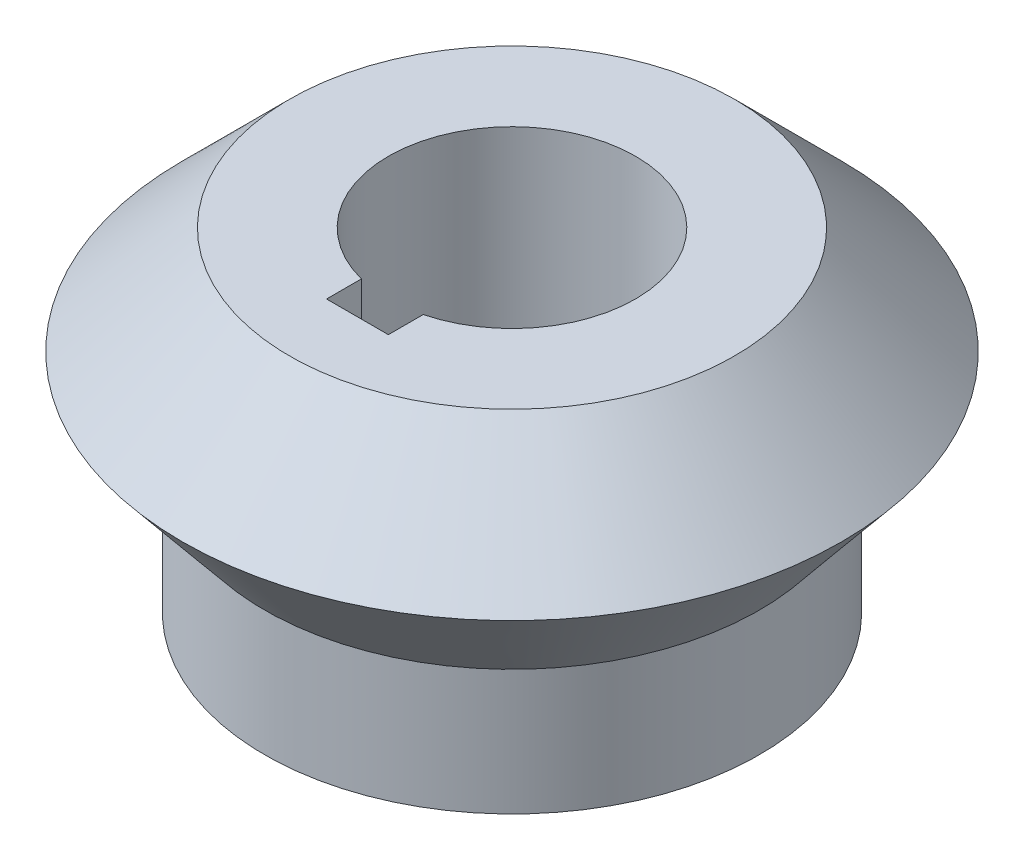
ISO-10303-21;
HEADER;
FILE_DESCRIPTION(('STEP AP214'),'2;1');
FILE_NAME('part.step','',(''),(''),'','','');
FILE_SCHEMA(('AUTOMOTIVE_DESIGN { 1 0 10303 214 1 1 1 1 }'));
ENDSEC;
DATA;
#1=APPLICATION_CONTEXT('core data for automotive mechanical design processes');
#2=APPLICATION_PROTOCOL_DEFINITION('international standard','automotive_design',2000,#1);
#3=PRODUCT_CONTEXT('',#1,'mechanical');
#4=PRODUCT('Part','Part','',(#3));
#5=PRODUCT_RELATED_PRODUCT_CATEGORY('part','',(#4));
#6=PRODUCT_DEFINITION_FORMATION('','',#4);
#7=PRODUCT_DEFINITION_CONTEXT('part definition',#1,'design');
#8=PRODUCT_DEFINITION('design','',#6,#7);
#9=PRODUCT_DEFINITION_SHAPE('','',#8);
#10=(LENGTH_UNIT() NAMED_UNIT(*) SI_UNIT(.MILLI.,.METRE.));
#11=(NAMED_UNIT(*) PLANE_ANGLE_UNIT() SI_UNIT($,.RADIAN.));
#12=(NAMED_UNIT(*) SI_UNIT($,.STERADIAN.) SOLID_ANGLE_UNIT());
#13=UNCERTAINTY_MEASURE_WITH_UNIT(LENGTH_MEASURE(1.E-05),#10,'distance_accuracy_value','');
#14=(GEOMETRIC_REPRESENTATION_CONTEXT(3) GLOBAL_UNCERTAINTY_ASSIGNED_CONTEXT((#13)) GLOBAL_UNIT_ASSIGNED_CONTEXT((#10,
#11,#12)) REPRESENTATION_CONTEXT('',''));
#15=CARTESIAN_POINT('',(0.,0.,0.));
#16=DIRECTION('',(0.,0.,1.));
#17=DIRECTION('',(1.,0.,0.));
#18=AXIS2_PLACEMENT_3D('',#15,#16,#17);
#19=CARTESIAN_POINT('',(0.,8.696071,0.));
#20=DIRECTION('',(0.,-1.,0.));
#21=DIRECTION('',(0.,0.,-1.));
#22=AXIS2_PLACEMENT_3D('',#19,#20,#21);
#23=CONICAL_SURFACE('',#22,12.7,0.785398163397449);
#24=CARTESIAN_POINT('',(0.,12.827,0.));
#25=DIRECTION('',(0.,-1.,0.));
#26=DIRECTION('',(0.,0.,-1.));
#27=AXIS2_PLACEMENT_3D('',#24,#25,#26);
#28=CIRCLE('',#27,8.569071);
#29=CARTESIAN_POINT('',(0.,12.827,-8.569071));
#30=VERTEX_POINT('',#29);
#31=EDGE_CURVE('E20',#30,#30,#28,.F.);
#32=ORIENTED_EDGE('',*,*,#31,.F.);
#33=EDGE_LOOP('',(#32));
#34=FACE_BOUND('',#33,.T.);
#35=CARTESIAN_POINT('',(0.,8.696071,0.));
#36=DIRECTION('',(0.,1.,0.));
#37=DIRECTION('',(0.,0.,1.));
#38=AXIS2_PLACEMENT_3D('',#35,#36,#37);
#39=CIRCLE('',#38,12.7);
#40=CARTESIAN_POINT('',(0.,8.696071,12.7));
#41=VERTEX_POINT('',#40);
#42=EDGE_CURVE('E94',#41,#41,#39,.F.);
#43=ORIENTED_EDGE('',*,*,#42,.F.);
#44=EDGE_LOOP('',(#43));
#45=FACE_BOUND('',#44,.T.);
#46=ADVANCED_FACE('F17',(#34,#45),#23,.T.);
#47=CARTESIAN_POINT('',(0.,8.696071,0.));
#48=DIRECTION('',(0.,1.,0.));
#49=DIRECTION('',(0.,0.,1.));
#50=AXIS2_PLACEMENT_3D('',#47,#48,#49);
#51=CONICAL_SURFACE('',#50,12.7,0.687055815057341);
#52=CARTESIAN_POINT('',(0.,4.826,0.));
#53=DIRECTION('',(0.,-1.,0.));
#54=DIRECTION('',(0.,0.,-1.));
#55=AXIS2_PLACEMENT_3D('',#52,#53,#54);
#56=CIRCLE('',#55,9.525);
#57=CARTESIAN_POINT('',(0.,4.826,-9.525));
#58=VERTEX_POINT('',#57);
#59=EDGE_CURVE('E74',#58,#58,#56,.T.);
#60=ORIENTED_EDGE('',*,*,#59,.F.);
#61=EDGE_LOOP('',(#60));
#62=FACE_BOUND('',#61,.T.);
#63=ORIENTED_EDGE('',*,*,#42,.T.);
#64=EDGE_LOOP('',(#63));
#65=FACE_BOUND('',#64,.T.);
#66=ADVANCED_FACE('F147',(#62,#65),#51,.T.);
#67=CARTESIAN_POINT('',(-1.190625,19.304,5.953125));
#68=DIRECTION('',(1.,0.,0.));
#69=DIRECTION('',(0.,0.,-1.));
#70=AXIS2_PLACEMENT_3D('',#67,#68,#69);
#71=PLANE('',#70);
#72=DIRECTION('',(0.,0.,-1.));
#73=VECTOR('',#72,1.);
#74=CARTESIAN_POINT('',(-1.190625,0.,5.953125));
#75=LINE('',#74,#73);
#76=CARTESIAN_POINT('',(-1.190625,0.,5.953125));
#77=VERTEX_POINT('',#76);
#78=CARTESIAN_POINT('',(-1.190625,0.,4.61127079657821));
#79=VERTEX_POINT('',#78);
#80=EDGE_CURVE('E73',#77,#79,#75,.T.);
#81=ORIENTED_EDGE('',*,*,#80,.T.);
#82=DIRECTION('',(0.,-1.,0.));
#83=VECTOR('',#82,1.);
#84=CARTESIAN_POINT('',(-1.190625,0.,4.61127079657821));
#85=LINE('',#84,#83);
#86=CARTESIAN_POINT('',(-1.190625,12.827,4.61127079657821));
#87=VERTEX_POINT('',#86);
#88=EDGE_CURVE('E67',#79,#87,#85,.F.);
#89=ORIENTED_EDGE('',*,*,#88,.T.);
#90=DIRECTION('',(0.,0.,1.));
#91=VECTOR('',#90,1.);
#92=CARTESIAN_POINT('',(-1.190625,12.827,0.));
#93=LINE('',#92,#91);
#94=CARTESIAN_POINT('',(-1.190625,12.827,5.953125));
#95=VERTEX_POINT('',#94);
#96=EDGE_CURVE('E59',#95,#87,#93,.F.);
#97=ORIENTED_EDGE('',*,*,#96,.F.);
#98=DIRECTION('',(0.,1.,0.));
#99=VECTOR('',#98,1.);
#100=CARTESIAN_POINT('',(-1.190625,19.304,5.953125));
#101=LINE('',#100,#99);
#102=EDGE_CURVE('E100',#77,#95,#101,.T.);
#103=ORIENTED_EDGE('',*,*,#102,.F.);
#104=EDGE_LOOP('',(#81,#89,#97,#103));
#105=FACE_BOUND('',#104,.T.);
#106=ADVANCED_FACE('F71',(#105),#71,.T.);
#107=CARTESIAN_POINT('',(1.190625,19.304,3.571875));
#108=DIRECTION('',(-1.,0.,0.));
#109=DIRECTION('',(0.,0.,1.));
#110=AXIS2_PLACEMENT_3D('',#107,#108,#109);
#111=PLANE('',#110);
#112=DIRECTION('',(0.,0.,1.));
#113=VECTOR('',#112,1.);
#114=CARTESIAN_POINT('',(1.190625,12.827,0.));
#115=LINE('',#114,#113);
#116=CARTESIAN_POINT('',(1.190625,12.827,4.61127079657821));
#117=VERTEX_POINT('',#116);
#118=CARTESIAN_POINT('',(1.190625,12.827,5.953125));
#119=VERTEX_POINT('',#118);
#120=EDGE_CURVE('E50',#117,#119,#115,.T.);
#121=ORIENTED_EDGE('',*,*,#120,.F.);
#122=DIRECTION('',(0.,-1.,0.));
#123=VECTOR('',#122,1.);
#124=CARTESIAN_POINT('',(1.190625,0.,4.61127079657821));
#125=LINE('',#124,#123);
#126=CARTESIAN_POINT('',(1.190625,0.,4.61127079657821));
#127=VERTEX_POINT('',#126);
#128=EDGE_CURVE('E68',#117,#127,#125,.T.);
#129=ORIENTED_EDGE('',*,*,#128,.T.);
#130=DIRECTION('',(0.,0.,1.));
#131=VECTOR('',#130,1.);
#132=CARTESIAN_POINT('',(1.190625,0.,3.571875));
#133=LINE('',#132,#131);
#134=CARTESIAN_POINT('',(1.190625,0.,5.953125));
#135=VERTEX_POINT('',#134);
#136=EDGE_CURVE('E84',#127,#135,#133,.T.);
#137=ORIENTED_EDGE('',*,*,#136,.T.);
#138=DIRECTION('',(0.,1.,0.));
#139=VECTOR('',#138,1.);
#140=CARTESIAN_POINT('',(1.190625,19.304,5.953125));
#141=LINE('',#140,#139);
#142=EDGE_CURVE('E63',#119,#135,#141,.F.);
#143=ORIENTED_EDGE('',*,*,#142,.F.);
#144=EDGE_LOOP('',(#121,#129,#137,#143));
#145=FACE_BOUND('',#144,.T.);
#146=ADVANCED_FACE('F131',(#145),#111,.T.);
#147=CARTESIAN_POINT('',(4.7625,12.827,0.));
#148=DIRECTION('',(0.,1.,0.));
#149=DIRECTION('',(0.,0.,1.));
#150=AXIS2_PLACEMENT_3D('',#147,#148,#149);
#151=PLANE('',#150);
#152=CARTESIAN_POINT('',(0.,12.827,0.));
#153=DIRECTION('',(0.,-1.,0.));
#154=DIRECTION('',(0.,0.,-1.));
#155=AXIS2_PLACEMENT_3D('',#152,#153,#154);
#156=CIRCLE('',#155,4.7625);
#157=EDGE_CURVE('E65',#87,#117,#156,.T.);
#158=ORIENTED_EDGE('',*,*,#157,.T.);
#159=ORIENTED_EDGE('',*,*,#120,.T.);
#160=DIRECTION('',(-1.,0.,0.));
#161=VECTOR('',#160,1.);
#162=CARTESIAN_POINT('',(1.190625,12.827,5.953125));
#163=LINE('',#162,#161);
#164=EDGE_CURVE('E79',#95,#119,#163,.F.);
#165=ORIENTED_EDGE('',*,*,#164,.F.);
#166=ORIENTED_EDGE('',*,*,#96,.T.);
#167=EDGE_LOOP('',(#158,#159,#165,#166));
#168=FACE_BOUND('',#167,.T.);
#169=ORIENTED_EDGE('',*,*,#31,.T.);
#170=EDGE_LOOP('',(#169));
#171=FACE_BOUND('',#170,.T.);
#172=ADVANCED_FACE('F76',(#168,#171),#151,.T.);
#173=CARTESIAN_POINT('',(0.,0.,0.));
#174=DIRECTION('',(0.,-1.,0.));
#175=DIRECTION('',(0.,0.,-1.));
#176=AXIS2_PLACEMENT_3D('',#173,#174,#175);
#177=CYLINDRICAL_SURFACE('',#176,9.525);
#178=ORIENTED_EDGE('',*,*,#59,.T.);
#179=EDGE_LOOP('',(#178));
#180=FACE_BOUND('',#179,.T.);
#181=CARTESIAN_POINT('',(0.,0.,0.));
#182=DIRECTION('',(0.,-1.,0.));
#183=DIRECTION('',(0.,0.,-1.));
#184=AXIS2_PLACEMENT_3D('',#181,#182,#183);
#185=CIRCLE('',#184,9.525);
#186=CARTESIAN_POINT('',(0.,0.,-9.525));
#187=VERTEX_POINT('',#186);
#188=EDGE_CURVE('E70',#187,#187,#185,.T.);
#189=ORIENTED_EDGE('',*,*,#188,.F.);
#190=EDGE_LOOP('',(#189));
#191=FACE_BOUND('',#190,.T.);
#192=ADVANCED_FACE('F119',(#180,#191),#177,.T.);
#193=CARTESIAN_POINT('',(1.190625,19.304,5.953125));
#194=DIRECTION('',(0.,0.,-1.));
#195=DIRECTION('',(-1.,0.,0.));
#196=AXIS2_PLACEMENT_3D('',#193,#194,#195);
#197=PLANE('',#196);
#198=ORIENTED_EDGE('',*,*,#102,.T.);
#199=ORIENTED_EDGE('',*,*,#164,.T.);
#200=ORIENTED_EDGE('',*,*,#142,.T.);
#201=DIRECTION('',(1.,0.,0.));
#202=VECTOR('',#201,1.);
#203=CARTESIAN_POINT('',(9.525,0.,5.953125));
#204=LINE('',#203,#202);
#205=EDGE_CURVE('E11',#77,#135,#204,.T.);
#206=ORIENTED_EDGE('',*,*,#205,.F.);
#207=EDGE_LOOP('',(#198,#199,#200,#206));
#208=FACE_BOUND('',#207,.T.);
#209=ADVANCED_FACE('F121',(#208),#197,.T.);
#210=CARTESIAN_POINT('',(0.,0.,0.));
#211=DIRECTION('',(0.,-1.,0.));
#212=DIRECTION('',(0.,0.,-1.));
#213=AXIS2_PLACEMENT_3D('',#210,#211,#212);
#214=CYLINDRICAL_SURFACE('',#213,4.7625);
#215=ORIENTED_EDGE('',*,*,#157,.F.);
#216=ORIENTED_EDGE('',*,*,#88,.F.);
#217=CARTESIAN_POINT('',(0.,0.,0.));
#218=DIRECTION('',(0.,-1.,0.));
#219=DIRECTION('',(0.,0.,-1.));
#220=AXIS2_PLACEMENT_3D('',#217,#218,#219);
#221=CIRCLE('',#220,4.7625);
#222=EDGE_CURVE('E26',#127,#79,#221,.F.);
#223=ORIENTED_EDGE('',*,*,#222,.F.);
#224=ORIENTED_EDGE('',*,*,#128,.F.);
#225=EDGE_LOOP('',(#215,#216,#223,#224));
#226=FACE_BOUND('',#225,.T.);
#227=ADVANCED_FACE('F66',(#226),#214,.F.);
#228=CARTESIAN_POINT('',(9.525,0.,0.));
#229=DIRECTION('',(0.,-1.,0.));
#230=DIRECTION('',(0.,0.,-1.));
#231=AXIS2_PLACEMENT_3D('',#228,#229,#230);
#232=PLANE('',#231);
#233=ORIENTED_EDGE('',*,*,#136,.F.);
#234=ORIENTED_EDGE('',*,*,#222,.T.);
#235=ORIENTED_EDGE('',*,*,#80,.F.);
#236=ORIENTED_EDGE('',*,*,#205,.T.);
#237=EDGE_LOOP('',(#233,#234,#235,#236));
#238=FACE_BOUND('',#237,.T.);
#239=ORIENTED_EDGE('',*,*,#188,.T.);
#240=EDGE_LOOP('',(#239));
#241=FACE_BOUND('',#240,.T.);
#242=ADVANCED_FACE('F117',(#238,#241),#232,.T.);
#243=CLOSED_SHELL('',(#46,#66,#106,#146,#172,#192,#209,#227,#242));
#244=MANIFOLD_SOLID_BREP('B1',#243);
#245=ADVANCED_BREP_SHAPE_REPRESENTATION('',(#18,#244),#14);
#246=SHAPE_DEFINITION_REPRESENTATION(#9,#245);
ENDSEC;
END-ISO-10303-21;
